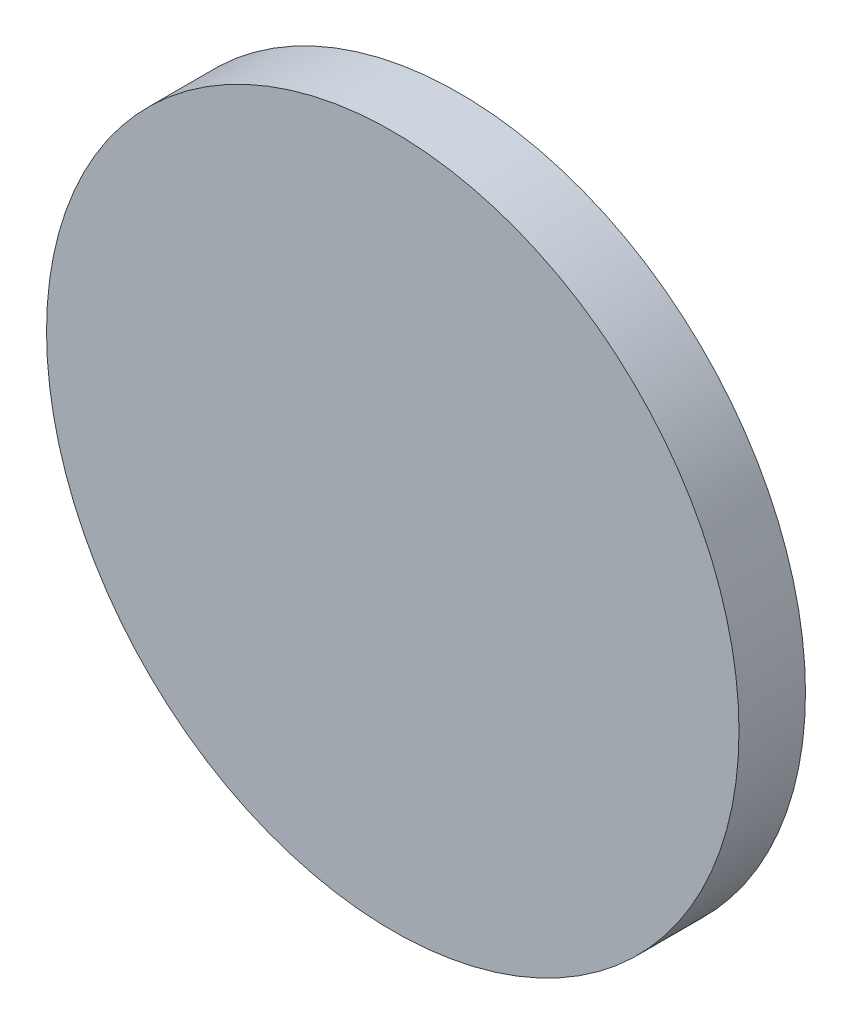
ISO-10303-21;
HEADER;
FILE_DESCRIPTION(('STEP AP214'),'2;1');
FILE_NAME('part.step','',(''),(''),'','','');
FILE_SCHEMA(('AUTOMOTIVE_DESIGN { 1 0 10303 214 1 1 1 1 }'));
ENDSEC;
DATA;
#1=APPLICATION_CONTEXT('core data for automotive mechanical design processes');
#2=APPLICATION_PROTOCOL_DEFINITION('international standard','automotive_design',2000,#1);
#3=PRODUCT_CONTEXT('',#1,'mechanical');
#4=PRODUCT('Part','Part','',(#3));
#5=PRODUCT_RELATED_PRODUCT_CATEGORY('part','',(#4));
#6=PRODUCT_DEFINITION_FORMATION('','',#4);
#7=PRODUCT_DEFINITION_CONTEXT('part definition',#1,'design');
#8=PRODUCT_DEFINITION('design','',#6,#7);
#9=PRODUCT_DEFINITION_SHAPE('','',#8);
#10=(LENGTH_UNIT() NAMED_UNIT(*) SI_UNIT(.MILLI.,.METRE.));
#11=(NAMED_UNIT(*) PLANE_ANGLE_UNIT() SI_UNIT($,.RADIAN.));
#12=(NAMED_UNIT(*) SI_UNIT($,.STERADIAN.) SOLID_ANGLE_UNIT());
#13=UNCERTAINTY_MEASURE_WITH_UNIT(LENGTH_MEASURE(1.E-05),#10,'distance_accuracy_value','');
#14=(GEOMETRIC_REPRESENTATION_CONTEXT(3) GLOBAL_UNCERTAINTY_ASSIGNED_CONTEXT((#13)) GLOBAL_UNIT_ASSIGNED_CONTEXT((#10,
#11,#12)) REPRESENTATION_CONTEXT('',''));
#15=CARTESIAN_POINT('',(0.,0.,0.));
#16=DIRECTION('',(0.,0.,1.));
#17=DIRECTION('',(1.,0.,0.));
#18=AXIS2_PLACEMENT_3D('',#15,#16,#17);
#19=CARTESIAN_POINT('',(0.,0.,2.4));
#20=DIRECTION('',(0.,0.,-1.));
#21=DIRECTION('',(-1.,0.,0.));
#22=AXIS2_PLACEMENT_3D('',#19,#20,#21);
#23=CYLINDRICAL_SURFACE('',#22,12.5);
#24=CARTESIAN_POINT('',(0.,0.,2.4));
#25=DIRECTION('',(0.,0.,1.));
#26=DIRECTION('',(1.,0.,0.));
#27=AXIS2_PLACEMENT_3D('',#24,#25,#26);
#28=CIRCLE('',#27,12.5);
#29=CARTESIAN_POINT('',(12.5,0.,2.4));
#30=VERTEX_POINT('',#29);
#31=EDGE_CURVE('E10',#30,#30,#28,.T.);
#32=ORIENTED_EDGE('',*,*,#31,.F.);
#33=EDGE_LOOP('',(#32));
#34=FACE_BOUND('',#33,.T.);
#35=CARTESIAN_POINT('',(0.,0.,0.));
#36=DIRECTION('',(0.,0.,1.));
#37=DIRECTION('',(1.,0.,0.));
#38=AXIS2_PLACEMENT_3D('',#35,#36,#37);
#39=CIRCLE('',#38,12.5);
#40=CARTESIAN_POINT('',(12.5,0.,0.));
#41=VERTEX_POINT('',#40);
#42=EDGE_CURVE('E34',#41,#41,#39,.T.);
#43=ORIENTED_EDGE('',*,*,#42,.T.);
#44=EDGE_LOOP('',(#43));
#45=FACE_BOUND('',#44,.T.);
#46=ADVANCED_FACE('F31',(#34,#45),#23,.T.);
#47=CARTESIAN_POINT('',(0.,0.,2.4));
#48=DIRECTION('',(0.,0.,1.));
#49=DIRECTION('',(1.,0.,0.));
#50=AXIS2_PLACEMENT_3D('',#47,#48,#49);
#51=PLANE('',#50);
#52=ORIENTED_EDGE('',*,*,#31,.T.);
#53=EDGE_LOOP('',(#52));
#54=FACE_BOUND('',#53,.T.);
#55=ADVANCED_FACE('F46',(#54),#51,.T.);
#56=CARTESIAN_POINT('',(0.,0.,0.));
#57=DIRECTION('',(0.,0.,1.));
#58=DIRECTION('',(1.,0.,0.));
#59=AXIS2_PLACEMENT_3D('',#56,#57,#58);
#60=PLANE('',#59);
#61=ORIENTED_EDGE('',*,*,#42,.F.);
#62=EDGE_LOOP('',(#61));
#63=FACE_BOUND('',#62,.T.);
#64=ADVANCED_FACE('F44',(#63),#60,.F.);
#65=CLOSED_SHELL('',(#46,#55,#64));
#66=MANIFOLD_SOLID_BREP('B2',#65);
#67=ADVANCED_BREP_SHAPE_REPRESENTATION('',(#18,#66),#14);
#68=SHAPE_DEFINITION_REPRESENTATION(#9,#67);
ENDSEC;
END-ISO-10303-21;
